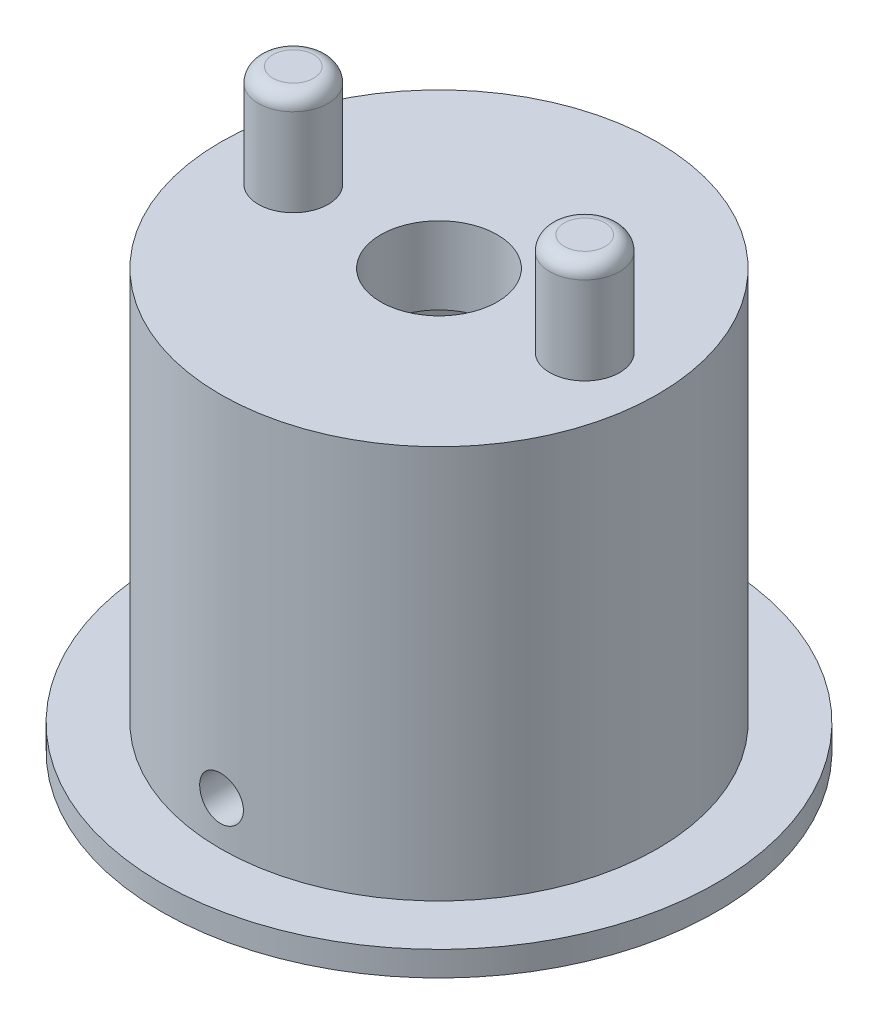
ISO-10303-21;
HEADER;
FILE_DESCRIPTION(('STEP AP214'),'2;1');
FILE_NAME('part.step','',(''),(''),'','','');
FILE_SCHEMA(('AUTOMOTIVE_DESIGN { 1 0 10303 214 1 1 1 1 }'));
ENDSEC;
DATA;
#1=APPLICATION_CONTEXT('core data for automotive mechanical design processes');
#2=APPLICATION_PROTOCOL_DEFINITION('international standard','automotive_design',2000,#1);
#3=PRODUCT_CONTEXT('',#1,'mechanical');
#4=PRODUCT('Part','Part','',(#3));
#5=PRODUCT_RELATED_PRODUCT_CATEGORY('part','',(#4));
#6=PRODUCT_DEFINITION_FORMATION('','',#4);
#7=PRODUCT_DEFINITION_CONTEXT('part definition',#1,'design');
#8=PRODUCT_DEFINITION('design','',#6,#7);
#9=PRODUCT_DEFINITION_SHAPE('','',#8);
#10=(LENGTH_UNIT() NAMED_UNIT(*) SI_UNIT(.MILLI.,.METRE.));
#11=(NAMED_UNIT(*) PLANE_ANGLE_UNIT() SI_UNIT($,.RADIAN.));
#12=(NAMED_UNIT(*) SI_UNIT($,.STERADIAN.) SOLID_ANGLE_UNIT());
#13=UNCERTAINTY_MEASURE_WITH_UNIT(LENGTH_MEASURE(1.E-05),#10,'distance_accuracy_value','');
#14=(GEOMETRIC_REPRESENTATION_CONTEXT(3) GLOBAL_UNCERTAINTY_ASSIGNED_CONTEXT((#13)) GLOBAL_UNIT_ASSIGNED_CONTEXT((#10,
#11,#12)) REPRESENTATION_CONTEXT('',''));
#15=CARTESIAN_POINT('',(0.,0.,0.));
#16=DIRECTION('',(0.,0.,1.));
#17=DIRECTION('',(1.,0.,0.));
#18=AXIS2_PLACEMENT_3D('',#15,#16,#17);
#19=CARTESIAN_POINT('',(0.,27.,0.));
#20=DIRECTION('',(0.,-1.,0.));
#21=DIRECTION('',(0.,0.,-1.));
#22=AXIS2_PLACEMENT_3D('',#19,#20,#21);
#23=CYLINDRICAL_SURFACE('',#22,15.);
#24=CARTESIAN_POINT('',(0.,4.5,-15.));
#25=CARTESIAN_POINT('',(-0.0840305306873359,4.49999636114943,-14.9999990328115));
#26=CARTESIAN_POINT('',(-0.16811661775166,4.49291509665534,-14.9992863839431));
#27=CARTESIAN_POINT('',(-0.333957597745256,4.46477344456436,-14.9965120139211));
#28=CARTESIAN_POINT('',(-0.415709818753242,4.44369765596312,-14.9944488065104));
#29=CARTESIAN_POINT('',(-0.574457513180122,4.38818663910325,-14.9892062184461));
#30=CARTESIAN_POINT('',(-0.651455826922364,4.35375947922229,-14.9860275120106));
#31=CARTESIAN_POINT('',(-0.79856424144061,4.27253863810254,-14.9789093609146));
#32=CARTESIAN_POINT('',(-0.868675708168615,4.22574741599979,-14.974970067572));
#33=CARTESIAN_POINT('',(-1.00028932601112,4.12094595350659,-14.9667561651199));
#34=CARTESIAN_POINT('',(-1.06176321725234,4.06290030089695,-14.962480523608));
#35=CARTESIAN_POINT('',(-1.17411378214648,3.93731319860546,-14.9540843535939));
#36=CARTESIAN_POINT('',(-1.22498996562398,3.86977130993642,-14.9499638322738));
#37=CARTESIAN_POINT('',(-1.31480095566542,3.72693220247457,-14.9423338732918));
#38=CARTESIAN_POINT('',(-1.35371019818232,3.65161883385771,-14.9388257506636));
#39=CARTESIAN_POINT('',(-1.41831957711414,3.49548662114253,-14.9328305631979));
#40=CARTESIAN_POINT('',(-1.44402003988694,3.41466791312408,-14.9303434731333));
#41=CARTESIAN_POINT('',(-1.48139856240284,3.25010729870099,-14.9266812610947));
#42=CARTESIAN_POINT('',(-1.49312347950569,3.16637613472169,-14.9255017559714));
#43=CARTESIAN_POINT('',(-1.50236292770304,2.99812670490633,-14.9245746459079));
#44=CARTESIAN_POINT('',(-1.4998778323062,2.91360845981691,-14.9248270033312));
#45=CARTESIAN_POINT('',(-1.48080642037902,2.74650703546002,-14.926731103484));
#46=CARTESIAN_POINT('',(-1.46427126618683,2.66391795100696,-14.9283777688598));
#47=CARTESIAN_POINT('',(-1.41764871622588,2.50269305519836,-14.9328770143113));
#48=CARTESIAN_POINT('',(-1.38756113738362,2.42405729726246,-14.9357296106774));
#49=CARTESIAN_POINT('',(-1.31463134082226,2.27280961905167,-14.9423251417811));
#50=CARTESIAN_POINT('',(-1.27176642407997,2.20020871576603,-14.9460696586224));
#51=CARTESIAN_POINT('',(-1.17451504102984,2.06321217763218,-14.9540257759932));
#52=CARTESIAN_POINT('',(-1.12012823750476,1.99881678302736,-14.9582373901918));
#53=CARTESIAN_POINT('',(-1.0010911686181,1.87976190901646,-14.9666757796948));
#54=CARTESIAN_POINT('',(-0.936396718277045,1.82514659717879,-14.970902539995));
#55=CARTESIAN_POINT('',(-0.798734222605669,1.72754455063442,-14.9788774361778));
#56=CARTESIAN_POINT('',(-0.725766167999401,1.68455782896529,-14.9826255715238));
#57=CARTESIAN_POINT('',(-0.573597158538547,1.61143496953462,-14.9892221350064));
#58=CARTESIAN_POINT('',(-0.494395119584855,1.58130107277291,-14.9920704062215));
#59=CARTESIAN_POINT('',(-0.332020825994898,1.53477162493237,-14.9965447116211));
#60=CARTESIAN_POINT('',(-0.248848690164901,1.51837566301407,-14.9981707823559));
#61=CARTESIAN_POINT('',(-0.081277648637856,1.49984353839785,-15.0000127750247));
#62=CARTESIAN_POINT('',(0.00311445315823741,1.49764642762125,-15.000234724016));
#63=CARTESIAN_POINT('',(0.171065689973549,1.50741429457315,-14.999259626352));
#64=CARTESIAN_POINT('',(0.254624836230705,1.51937908097292,-14.998062598867));
#65=CARTESIAN_POINT('',(0.418362310252012,1.55708054313237,-14.9943879230879));
#66=CARTESIAN_POINT('',(0.498547273458028,1.58278868171702,-14.9919129287706));
#67=CARTESIAN_POINT('',(0.653466482075672,1.64721776105591,-14.9859599829091));
#68=CARTESIAN_POINT('',(0.728200605235676,1.6859389935591,-14.9824820088788));
#69=CARTESIAN_POINT('',(0.870372270258214,1.77544625799587,-14.9748971299563));
#70=CARTESIAN_POINT('',(0.937784489623376,1.82627233338873,-14.9707881540516));
#71=CARTESIAN_POINT('',(1.06314243496782,1.93848910161139,-14.9624089930428));
#72=CARTESIAN_POINT('',(1.12108792327377,1.99988005960548,-14.9581388038946));
#73=CARTESIAN_POINT('',(1.22607916483072,2.1317498619885,-14.9499003621113));
#74=CARTESIAN_POINT('',(1.27308491801931,2.20226063481393,-14.9459332520846));
#75=CARTESIAN_POINT('',(1.35458738811574,2.35021104022003,-14.9387674869133));
#76=CARTESIAN_POINT('',(1.38908427608082,2.4276505780326,-14.9355688212606));
#77=CARTESIAN_POINT('',(1.44452281302671,2.58712310919869,-14.9303092145107));
#78=CARTESIAN_POINT('',(1.46548826221779,2.66914776013668,-14.9282462767468));
#79=CARTESIAN_POINT('',(1.49334601069419,2.83557479694116,-14.9254854792431));
#80=CARTESIAN_POINT('',(1.50023871359928,2.91997711454351,-14.9247875803528));
#81=CARTESIAN_POINT('',(1.49974970770688,3.08836603253506,-14.9248366966134));
#82=CARTESIAN_POINT('',(1.49243083438967,3.17235282432422,-14.9255773513051));
#83=CARTESIAN_POINT('',(1.46385817944548,3.33789737575243,-14.9284065583432));
#84=CARTESIAN_POINT('',(1.44260438214324,3.41945513265897,-14.9304951122058));
#85=CARTESIAN_POINT('',(1.38678252944625,3.57782602357179,-14.9357830239478));
#86=CARTESIAN_POINT('',(1.35221631651137,3.65463981244459,-14.9389822281054));
#87=CARTESIAN_POINT('',(1.27075733236657,3.80138533750656,-14.9461312775904));
#88=CARTESIAN_POINT('',(1.22386463018312,3.87131711223095,-14.9500811187143));
#89=CARTESIAN_POINT('',(1.118847834428,4.00263551170791,-14.9583073081455));
#90=CARTESIAN_POINT('',(1.0606769233354,4.06398461455063,-14.9625849709013));
#91=CARTESIAN_POINT('',(0.934847548837664,4.17607834904949,-14.9709728209317));
#92=CARTESIAN_POINT('',(0.867186816162385,4.22682043703576,-14.9750829678446));
#93=CARTESIAN_POINT('',(0.724112151241934,4.31636018078193,-14.9826834310374));
#94=CARTESIAN_POINT('',(0.648679124020145,4.35512743641778,-14.9861721604022));
#95=CARTESIAN_POINT('',(0.492387418650826,4.4193936342358,-14.9921194387484));
#96=CARTESIAN_POINT('',(0.411534974738414,4.44490753643032,-14.9945791486448));
#97=CARTESIAN_POINT('',(0.275187392108557,4.4755809256272,-14.997573206606));
#98=CARTESIAN_POINT('',(0.220563829266763,4.48472556644904,-14.9984790103775));
#99=CARTESIAN_POINT('',(0.110634871225969,4.49693628909265,-14.9996927242618));
#100=CARTESIAN_POINT('',(0.0553294788398368,4.5000023959828,-15.0000006368404));
#101=CARTESIAN_POINT('',(0.,4.5,-15.));
#102=B_SPLINE_CURVE_WITH_KNOTS('',3,(#24,#25,#26,#27,#28,#29,#30,#31,#32,#33,#34,#35,#36,#37,
#38,#39,#40,#41,#42,#43,#44,#45,#46,#47,#48,#49,#50,#51,#52,#53,#54,#55,#56,#57,#58,#59,#60,#61,
#62,#63,#64,#65,#66,#67,#68,#69,#70,#71,#72,#73,#74,#75,#76,#77,#78,#79,#80,#81,#82,#83,#84,#85,
#86,#87,#88,#89,#90,#91,#92,#93,#94,#95,#96,#97,#98,#99,#100,#101),.UNSPECIFIED.,.T.,.F.,(4,2,2,
2,2,2,2,2,2,2,2,2,2,2,2,2,2,2,2,2,2,2,2,2,2,2,2,2,2,2,2,2,2,2,2,2,2,2,4),(0.,0.251889549402711,
0.50405676425323,0.756071828598304,1.00803680637417,1.26080785293442,1.51359058831059,
1.76690963208333,2.02022241663756,2.27268348067795,2.52513790883665,2.77667696161666,
3.0282194124245,3.28021142059342,3.53221080496688,3.7853210129431,4.03843150469658,
4.29158611040372,4.54473314513159,4.79679282911636,5.04884910778715,5.30038402941457,
5.551924590742,5.80430911123048,6.05669996715345,6.30999965412898,6.56329587713061,
6.81614535889505,7.06898758859378,7.32071443940935,7.57244157339059,7.824133880442,
8.0758247780844,8.3285837614148,8.58140328955437,8.83485946539364,9.08802892192943,
9.25388500848523,9.41974041103541),.UNSPECIFIED.);
#103=CARTESIAN_POINT('',(0.,4.5,-15.));
#104=VERTEX_POINT('',#103);
#105=EDGE_CURVE('E231',#104,#104,#102,.T.);
#106=ORIENTED_EDGE('',*,*,#105,.T.);
#107=EDGE_LOOP('',(#106));
#108=FACE_BOUND('',#107,.T.);
#109=CARTESIAN_POINT('',(1.5,3.,14.9248115565993));
#110=CARTESIAN_POINT('',(1.49999636009027,2.9159706537396,14.9248125419535));
#111=CARTESIAN_POINT('',(1.49291528847371,2.83188574738224,14.9255288549133));
#112=CARTESIAN_POINT('',(1.46477447214534,2.6660472205597,14.9283163133718));
#113=CARTESIAN_POINT('',(1.44369932232965,2.58429627294377,14.9303889519183));
#114=CARTESIAN_POINT('',(1.38819017410339,2.42555127117314,14.9356519957108));
#115=CARTESIAN_POINT('',(1.35376427444085,2.34855436591284,14.9388417232018));
#116=CARTESIAN_POINT('',(1.27254640108665,2.20144831156238,14.9459787085773));
#117=CARTESIAN_POINT('',(1.22575688343889,2.13133779827443,14.9499258159649));
#118=CARTESIAN_POINT('',(1.12095714299806,1.99972310451375,14.9581489006485));
#119=CARTESIAN_POINT('',(1.06291112716239,1.93824748574433,14.962425900079));
#120=CARTESIAN_POINT('',(0.937322572979346,1.82589358649465,14.9708175785358));
#121=CARTESIAN_POINT('',(0.869779600359852,1.77501579089054,14.9749322501282));
#122=CARTESIAN_POINT('',(0.726939542476481,1.68520311448927,14.9825457473341));
#123=CARTESIAN_POINT('',(0.651626493794353,1.64629350180951,14.9860432634197));
#124=CARTESIAN_POINT('',(0.495494976431265,1.58168335027698,14.9920172531366));
#125=CARTESIAN_POINT('',(0.414676642002328,1.5559824894458,14.994493751656));
#126=CARTESIAN_POINT('',(0.250117174114424,1.51860313597013,14.9981394985654));
#127=CARTESIAN_POINT('',(0.166386790547372,1.50687775087508,14.9993131176423));
#128=CARTESIAN_POINT('',(-0.00186111103341474,1.49763709629943,15.0002357339804));
#129=CARTESIAN_POINT('',(-0.0863786085816919,1.50012145838059,14.9999847681791));
#130=CARTESIAN_POINT('',(-0.25348326609684,1.51919170897524,14.9980900696678));
#131=CARTESIAN_POINT('',(-0.336076244902468,1.53572717334584,14.9964513172757));
#132=CARTESIAN_POINT('',(-0.497308769256799,1.58235169341993,14.991970938974));
#133=CARTESIAN_POINT('',(-0.575948263436593,1.61244092518136,14.9891292974393));
#134=CARTESIAN_POINT('',(-0.727200472019379,1.68537414488166,14.9825540622587));
#135=CARTESIAN_POINT('',(-0.799802356472475,1.72824044629524,14.9788189104864));
#136=CARTESIAN_POINT('',(-0.936800269761291,1.82549478500456,14.9708757677911));
#137=CARTESIAN_POINT('',(-1.00119605784124,1.87988316021778,14.9666677630022));
#138=CARTESIAN_POINT('',(-1.12024915773403,1.99892134427047,14.9582294020178));
#139=CARTESIAN_POINT('',(-1.17486261928552,2.06361501711237,14.9539990285954));
#140=CARTESIAN_POINT('',(-1.27246130303688,2.20127529781617,14.9460110989233));
#141=CARTESIAN_POINT('',(-1.31544650836933,2.27424191767822,14.9422535433595));
#142=CARTESIAN_POINT('',(-1.38856827685985,2.42641053779969,14.9356363427122));
#143=CARTESIAN_POINT('',(-1.41870213085944,2.50561384863433,14.9327768869883));
#144=CARTESIAN_POINT('',(-1.46523110345638,2.66799090692203,14.9282835280641));
#145=CARTESIAN_POINT('',(-1.48162664061455,2.75116453333117,14.9266495875265));
#146=CARTESIAN_POINT('',(-1.50015716308794,2.91873626929426,14.9247987079113));
#147=CARTESIAN_POINT('',(-1.50235349497082,3.00312753039725,14.924575673214));
#148=CARTESIAN_POINT('',(-1.49258437030704,3.1710768987343,14.9255557703216));
#149=CARTESIAN_POINT('',(-1.48061910511463,3.25463501721055,14.9267588828559));
#150=CARTESIAN_POINT('',(-1.44291776176128,3.41836737341751,14.930450166336));
#151=CARTESIAN_POINT('',(-1.41721069078336,3.49854835664199,14.9329356300202));
#152=CARTESIAN_POINT('',(-1.35278507951391,3.65346007759546,14.9389093655819));
#153=CARTESIAN_POINT('',(-1.31406624117538,3.72819069043078,14.94239766043));
#154=CARTESIAN_POINT('',(-1.22456250213483,3.87035996104317,14.9499987653357));
#155=CARTESIAN_POINT('',(-1.17373694976104,3.93777291294938,14.9541136622201));
#156=CARTESIAN_POINT('',(-1.06152080017676,4.0631325799111,14.9624974893778));
#157=CARTESIAN_POINT('',(-1.0001299413722,4.12107906051012,14.966766423463));
#158=CARTESIAN_POINT('',(-0.868259706339711,4.22607245009714,14.9749957177395));
#159=CARTESIAN_POINT('',(-0.797748383954178,4.27307933937933,14.9789549108321));
#160=CARTESIAN_POINT('',(-0.649796576125697,4.35458380275962,14.9861016315995));
#161=CARTESIAN_POINT('',(-0.572356185644439,4.38908154826066,14.9892891698474));
#162=CARTESIAN_POINT('',(-0.412884189649224,4.44452065148301,14.9945281562101));
#163=CARTESIAN_POINT('',(-0.33086105647494,4.46548618098782,14.9965816290847));
#164=CARTESIAN_POINT('',(-0.16443722097552,4.49334460436977,14.9993294192047));
#165=CARTESIAN_POINT('',(-0.0800365855383273,4.50023789375106,15.0000237746484));
#166=CARTESIAN_POINT('',(0.0883533361136191,4.49975060034009,14.999975074699));
#167=CARTESIAN_POINT('',(0.172342810836791,4.49243214474502,14.99923827565));
#168=CARTESIAN_POINT('',(0.337892832534543,4.46385938151454,14.9964224036639));
#169=CARTESIAN_POINT('',(0.419453377602548,4.44260506294055,14.9943433296731));
#170=CARTESIAN_POINT('',(0.577829863151615,4.3867811139106,14.9890758572094));
#171=CARTESIAN_POINT('',(0.654646449116292,4.35221329959877,14.9858876100487));
#172=CARTESIAN_POINT('',(0.801396900232193,4.27075024662453,14.9787571862444));
#173=CARTESIAN_POINT('',(0.871330805652838,4.22385508009333,14.9748150140123));
#174=CARTESIAN_POINT('',(1.00264908664041,4.11883557146438,14.9665977700358));
#175=CARTESIAN_POINT('',(1.06399638932901,4.0606649756328,14.9623213719105));
#176=CARTESIAN_POINT('',(1.17608663908971,3.93483697268183,14.9539288615449));
#177=CARTESIAN_POINT('',(1.22682703777177,3.86717729224639,14.9498127880167));
#178=CARTESIAN_POINT('',(1.31636496063608,3.72410348712014,14.942195751159));
#179=CARTESIAN_POINT('',(1.35513178199225,3.64867007801392,14.9386963788796));
#180=CARTESIAN_POINT('',(1.41939706214815,3.49237756313065,14.9327279214369));
#181=CARTESIAN_POINT('',(1.44491048683479,3.41152469411143,14.9302576748004));
#182=CARTESIAN_POINT('',(1.47558253250029,3.27517838865133,14.9272501130722));
#183=CARTESIAN_POINT('',(1.48472656859734,3.22055662304036,14.9263399790354));
#184=CARTESIAN_POINT('',(1.49693648790767,3.11063126543617,14.9251203776649));
#185=CARTESIAN_POINT('',(1.5000023966359,3.05532767630611,14.9248109078098));
#186=CARTESIAN_POINT('',(1.5,3.,14.9248115565993));
#187=B_SPLINE_CURVE_WITH_KNOTS('',3,(#109,#110,#111,#112,#113,#114,#115,#116,#117,#118,#119,
#120,#121,#122,#123,#124,#125,#126,#127,#128,#129,#130,#131,#132,#133,#134,#135,#136,#137,#138,
#139,#140,#141,#142,#143,#144,#145,#146,#147,#148,#149,#150,#151,#152,#153,#154,#155,#156,#157,
#158,#159,#160,#161,#162,#163,#164,#165,#166,#167,#168,#169,#170,#171,#172,#173,#174,#175,#176,
#177,#178,#179,#180,#181,#182,#183,#184,#185,#186),.UNSPECIFIED.,.T.,.F.,(4,2,2,2,2,2,2,2,2,2,2,
2,2,2,2,2,2,2,2,2,2,2,2,2,2,2,2,2,2,2,2,2,2,2,2,2,2,2,4),(0.,0.251885991654692,
0.504049727732655,0.756060736496211,1.00802172063197,1.26079742294888,1.51358468782879,
1.76690204956938,2.02021323611692,2.27267206347674,2.52512434497348,2.77667447727992,
3.02822787721461,3.2802231819962,3.53222587827793,3.78533137627502,4.03843724141344,
4.291596436769,4.54474791892549,4.79680494461648,5.04885856450305,5.30038222056791,
5.55191163841571,5.80429784717577,6.05669030584804,6.30999205227177,6.56329032777007,
6.81613489041542,7.06897234669724,7.32070700202724,7.57244185494987,7.82414237992869,
8.07584143216198,8.32859572556982,8.58141067551787,8.83486861605715,9.08803972341001,
9.2538904140907,9.41974040855723),.UNSPECIFIED.);
#188=CARTESIAN_POINT('',(1.5,3.,14.9248115565993));
#189=VERTEX_POINT('',#188);
#190=EDGE_CURVE('E225',#189,#189,#187,.T.);
#191=ORIENTED_EDGE('',*,*,#190,.T.);
#192=EDGE_LOOP('',(#191));
#193=FACE_BOUND('',#192,.T.);
#194=CARTESIAN_POINT('',(0.,27.,0.));
#195=DIRECTION('',(0.,1.,0.));
#196=DIRECTION('',(0.,0.,1.));
#197=AXIS2_PLACEMENT_3D('',#194,#195,#196);
#198=CIRCLE('',#197,15.);
#199=CARTESIAN_POINT('',(0.,27.,15.));
#200=VERTEX_POINT('',#199);
#201=EDGE_CURVE('E174',#200,#200,#198,.T.);
#202=ORIENTED_EDGE('',*,*,#201,.F.);
#203=EDGE_LOOP('',(#202));
#204=FACE_BOUND('',#203,.T.);
#205=CARTESIAN_POINT('',(0.,0.,0.));
#206=DIRECTION('',(0.,1.,0.));
#207=DIRECTION('',(0.,0.,1.));
#208=AXIS2_PLACEMENT_3D('',#205,#206,#207);
#209=CIRCLE('',#208,15.);
#210=CARTESIAN_POINT('',(0.,0.,15.));
#211=VERTEX_POINT('',#210);
#212=EDGE_CURVE('E170',#211,#211,#209,.T.);
#213=ORIENTED_EDGE('',*,*,#212,.T.);
#214=EDGE_LOOP('',(#213));
#215=FACE_BOUND('',#214,.T.);
#216=ADVANCED_FACE('F39',(#108,#193,#204,#215),#23,.T.);
#217=CARTESIAN_POINT('',(0.,27.,0.));
#218=DIRECTION('',(0.,1.,0.));
#219=DIRECTION('',(0.,0.,1.));
#220=AXIS2_PLACEMENT_3D('',#217,#218,#219);
#221=PLANE('',#220);
#222=CARTESIAN_POINT('',(10.,27.,0.));
#223=DIRECTION('',(0.,1.,0.));
#224=DIRECTION('',(0.,0.,1.));
#225=AXIS2_PLACEMENT_3D('',#222,#223,#224);
#226=CIRCLE('',#225,2.4);
#227=CARTESIAN_POINT('',(10.,27.,2.4));
#228=VERTEX_POINT('',#227);
#229=EDGE_CURVE('E237',#228,#228,#226,.T.);
#230=ORIENTED_EDGE('',*,*,#229,.F.);
#231=EDGE_LOOP('',(#230));
#232=FACE_BOUND('',#231,.T.);
#233=CARTESIAN_POINT('',(-10.,27.,0.));
#234=DIRECTION('',(0.,1.,0.));
#235=DIRECTION('',(0.,0.,1.));
#236=AXIS2_PLACEMENT_3D('',#233,#234,#235);
#237=CIRCLE('',#236,2.4);
#238=CARTESIAN_POINT('',(-10.,27.,2.4));
#239=VERTEX_POINT('',#238);
#240=EDGE_CURVE('E436',#239,#239,#237,.T.);
#241=ORIENTED_EDGE('',*,*,#240,.F.);
#242=EDGE_LOOP('',(#241));
#243=FACE_BOUND('',#242,.T.);
#244=CARTESIAN_POINT('',(0.,27.,0.));
#245=DIRECTION('',(0.,1.,0.));
#246=DIRECTION('',(0.,0.,1.));
#247=AXIS2_PLACEMENT_3D('',#244,#245,#246);
#248=CIRCLE('',#247,4.);
#249=CARTESIAN_POINT('',(0.,27.,4.));
#250=VERTEX_POINT('',#249);
#251=EDGE_CURVE('E137',#250,#250,#248,.F.);
#252=ORIENTED_EDGE('',*,*,#251,.T.);
#253=EDGE_LOOP('',(#252));
#254=FACE_BOUND('',#253,.T.);
#255=ORIENTED_EDGE('',*,*,#201,.T.);
#256=EDGE_LOOP('',(#255));
#257=FACE_BOUND('',#256,.T.);
#258=ADVANCED_FACE('F210',(#232,#243,#254,#257),#221,.T.);
#259=CARTESIAN_POINT('',(0.,-1.7,0.));
#260=DIRECTION('',(0.,1.,0.));
#261=DIRECTION('',(0.,0.,1.));
#262=AXIS2_PLACEMENT_3D('',#259,#260,#261);
#263=CYLINDRICAL_SURFACE('',#262,19.07);
#264=CARTESIAN_POINT('',(0.,-1.7,0.));
#265=DIRECTION('',(0.,-1.,0.));
#266=DIRECTION('',(0.,0.,-1.));
#267=AXIS2_PLACEMENT_3D('',#264,#265,#266);
#268=CIRCLE('',#267,19.07);
#269=CARTESIAN_POINT('',(0.,-1.7,-19.07));
#270=VERTEX_POINT('',#269);
#271=EDGE_CURVE('E166',#270,#270,#268,.T.);
#272=ORIENTED_EDGE('',*,*,#271,.F.);
#273=EDGE_LOOP('',(#272));
#274=FACE_BOUND('',#273,.T.);
#275=CARTESIAN_POINT('',(0.,0.,0.));
#276=DIRECTION('',(0.,-1.,0.));
#277=DIRECTION('',(0.,0.,-1.));
#278=AXIS2_PLACEMENT_3D('',#275,#276,#277);
#279=CIRCLE('',#278,19.07);
#280=CARTESIAN_POINT('',(0.,0.,-19.07));
#281=VERTEX_POINT('',#280);
#282=EDGE_CURVE('E156',#281,#281,#279,.T.);
#283=ORIENTED_EDGE('',*,*,#282,.T.);
#284=EDGE_LOOP('',(#283));
#285=FACE_BOUND('',#284,.T.);
#286=ADVANCED_FACE('F216',(#274,#285),#263,.T.);
#287=CARTESIAN_POINT('',(0.,-1.7,0.));
#288=DIRECTION('',(0.,-1.,0.));
#289=DIRECTION('',(0.,0.,-1.));
#290=AXIS2_PLACEMENT_3D('',#287,#288,#289);
#291=PLANE('',#290);
#292=DIRECTION('',(-1.,0.,0.));
#293=VECTOR('',#292,1.);
#294=CARTESIAN_POINT('',(2.80014880556968,-1.7,4.85));
#295=LINE('',#294,#293);
#296=CARTESIAN_POINT('',(2.80014880556968,-1.7,4.85));
#297=VERTEX_POINT('',#296);
#298=CARTESIAN_POINT('',(-2.80014880556969,-1.7,4.85));
#299=VERTEX_POINT('',#298);
#300=EDGE_CURVE('E56',#297,#299,#295,.T.);
#301=ORIENTED_EDGE('',*,*,#300,.F.);
#302=DIRECTION('',(-0.500000000000001,0.,0.866025403784438));
#303=VECTOR('',#302,1.);
#304=CARTESIAN_POINT('',(5.60029761113937,-1.7,0.));
#305=LINE('',#304,#303);
#306=CARTESIAN_POINT('',(5.60029761113937,-1.7,0.));
#307=VERTEX_POINT('',#306);
#308=EDGE_CURVE('E150',#307,#297,#305,.T.);
#309=ORIENTED_EDGE('',*,*,#308,.F.);
#310=DIRECTION('',(0.5,0.,0.866025403784439));
#311=VECTOR('',#310,1.);
#312=CARTESIAN_POINT('',(2.80014880556968,-1.7,-4.85));
#313=LINE('',#312,#311);
#314=CARTESIAN_POINT('',(2.80014880556968,-1.7,-4.85));
#315=VERTEX_POINT('',#314);
#316=EDGE_CURVE('E147',#315,#307,#313,.T.);
#317=ORIENTED_EDGE('',*,*,#316,.F.);
#318=DIRECTION('',(1.,0.,0.));
#319=VECTOR('',#318,1.);
#320=CARTESIAN_POINT('',(-2.80014880556968,-1.7,-4.85));
#321=LINE('',#320,#319);
#322=CARTESIAN_POINT('',(-2.80014880556968,-1.7,-4.85));
#323=VERTEX_POINT('',#322);
#324=EDGE_CURVE('E104',#323,#315,#321,.T.);
#325=ORIENTED_EDGE('',*,*,#324,.F.);
#326=DIRECTION('',(0.500000000000001,0.,-0.866025403784438));
#327=VECTOR('',#326,1.);
#328=CARTESIAN_POINT('',(-5.60029761113937,-1.7,0.));
#329=LINE('',#328,#327);
#330=CARTESIAN_POINT('',(-5.60029761113937,-1.7,0.));
#331=VERTEX_POINT('',#330);
#332=EDGE_CURVE('E141',#331,#323,#329,.T.);
#333=ORIENTED_EDGE('',*,*,#332,.F.);
#334=DIRECTION('',(-0.5,0.,-0.866025403784439));
#335=VECTOR('',#334,1.);
#336=CARTESIAN_POINT('',(-2.80014880556969,-1.7,4.85));
#337=LINE('',#336,#335);
#338=EDGE_CURVE('E136',#299,#331,#337,.T.);
#339=ORIENTED_EDGE('',*,*,#338,.F.);
#340=EDGE_LOOP('',(#301,#309,#317,#325,#333,#339));
#341=FACE_BOUND('',#340,.T.);
#342=ORIENTED_EDGE('',*,*,#271,.T.);
#343=EDGE_LOOP('',(#342));
#344=FACE_BOUND('',#343,.T.);
#345=ADVANCED_FACE('F283',(#341,#344),#291,.T.);
#346=CARTESIAN_POINT('',(0.,0.,0.));
#347=DIRECTION('',(0.,-1.,0.));
#348=DIRECTION('',(0.,0.,-1.));
#349=AXIS2_PLACEMENT_3D('',#346,#347,#348);
#350=PLANE('',#349);
#351=ORIENTED_EDGE('',*,*,#212,.F.);
#352=EDGE_LOOP('',(#351));
#353=FACE_BOUND('',#352,.T.);
#354=ORIENTED_EDGE('',*,*,#282,.F.);
#355=EDGE_LOOP('',(#354));
#356=FACE_BOUND('',#355,.T.);
#357=ADVANCED_FACE('F281',(#353,#356),#350,.F.);
#358=CARTESIAN_POINT('',(2.80014880556968,21.7,4.85));
#359=DIRECTION('',(0.,0.,1.));
#360=DIRECTION('',(1.,0.,0.));
#361=AXIS2_PLACEMENT_3D('',#358,#359,#360);
#362=PLANE('',#361);
#363=CARTESIAN_POINT('',(0.,3.,4.85));
#364=DIRECTION('',(0.,0.,1.));
#365=DIRECTION('',(1.,0.,0.));
#366=AXIS2_PLACEMENT_3D('',#363,#364,#365);
#367=CIRCLE('',#366,1.5);
#368=CARTESIAN_POINT('',(1.5,3.,4.85));
#369=VERTEX_POINT('',#368);
#370=EDGE_CURVE('E423',#369,#369,#367,.T.);
#371=ORIENTED_EDGE('',*,*,#370,.T.);
#372=EDGE_LOOP('',(#371));
#373=FACE_BOUND('',#372,.T.);
#374=ORIENTED_EDGE('',*,*,#300,.T.);
#375=DIRECTION('',(0.,-1.,0.));
#376=VECTOR('',#375,1.);
#377=CARTESIAN_POINT('',(-2.80014880556969,21.7,4.85));
#378=LINE('',#377,#376);
#379=CARTESIAN_POINT('',(-2.80014880556969,21.7,4.85));
#380=VERTEX_POINT('',#379);
#381=EDGE_CURVE('E86',#380,#299,#378,.T.);
#382=ORIENTED_EDGE('',*,*,#381,.F.);
#383=DIRECTION('',(-1.,0.,0.));
#384=VECTOR('',#383,1.);
#385=CARTESIAN_POINT('',(2.80014880556968,21.7,4.85));
#386=LINE('',#385,#384);
#387=CARTESIAN_POINT('',(2.80014880556968,21.7,4.85));
#388=VERTEX_POINT('',#387);
#389=EDGE_CURVE('E153',#388,#380,#386,.T.);
#390=ORIENTED_EDGE('',*,*,#389,.F.);
#391=DIRECTION('',(0.,-1.,0.));
#392=VECTOR('',#391,1.);
#393=CARTESIAN_POINT('',(2.80014880556968,21.7,4.85));
#394=LINE('',#393,#392);
#395=EDGE_CURVE('E64',#388,#297,#394,.T.);
#396=ORIENTED_EDGE('',*,*,#395,.T.);
#397=EDGE_LOOP('',(#374,#382,#390,#396));
#398=FACE_BOUND('',#397,.T.);
#399=ADVANCED_FACE('F266',(#373,#398),#362,.F.);
#400=CARTESIAN_POINT('',(5.60029761113937,21.7,0.));
#401=DIRECTION('',(0.866025403784438,0.,0.500000000000001));
#402=DIRECTION('',(0.500000000000001,0.,-0.866025403784438));
#403=AXIS2_PLACEMENT_3D('',#400,#401,#402);
#404=PLANE('',#403);
#405=ORIENTED_EDGE('',*,*,#308,.T.);
#406=ORIENTED_EDGE('',*,*,#395,.F.);
#407=DIRECTION('',(-0.500000000000001,0.,0.866025403784438));
#408=VECTOR('',#407,1.);
#409=CARTESIAN_POINT('',(5.60029761113937,21.7,0.));
#410=LINE('',#409,#408);
#411=CARTESIAN_POINT('',(5.60029761113937,21.7,0.));
#412=VERTEX_POINT('',#411);
#413=EDGE_CURVE('E118',#412,#388,#410,.T.);
#414=ORIENTED_EDGE('',*,*,#413,.F.);
#415=DIRECTION('',(0.,-1.,0.));
#416=VECTOR('',#415,1.);
#417=CARTESIAN_POINT('',(5.60029761113937,21.7,0.));
#418=LINE('',#417,#416);
#419=EDGE_CURVE('E109',#412,#307,#418,.T.);
#420=ORIENTED_EDGE('',*,*,#419,.T.);
#421=EDGE_LOOP('',(#405,#406,#414,#420));
#422=FACE_BOUND('',#421,.T.);
#423=ADVANCED_FACE('F263',(#422),#404,.F.);
#424=CARTESIAN_POINT('',(2.80014880556968,21.7,-4.85));
#425=DIRECTION('',(0.866025403784439,0.,-0.5));
#426=DIRECTION('',(-0.5,0.,-0.866025403784439));
#427=AXIS2_PLACEMENT_3D('',#424,#425,#426);
#428=PLANE('',#427);
#429=ORIENTED_EDGE('',*,*,#316,.T.);
#430=ORIENTED_EDGE('',*,*,#419,.F.);
#431=DIRECTION('',(0.5,0.,0.866025403784439));
#432=VECTOR('',#431,1.);
#433=CARTESIAN_POINT('',(2.80014880556968,21.7,-4.85));
#434=LINE('',#433,#432);
#435=CARTESIAN_POINT('',(2.80014880556968,21.7,-4.85));
#436=VERTEX_POINT('',#435);
#437=EDGE_CURVE('E113',#436,#412,#434,.T.);
#438=ORIENTED_EDGE('',*,*,#437,.F.);
#439=DIRECTION('',(0.,-1.,0.));
#440=VECTOR('',#439,1.);
#441=CARTESIAN_POINT('',(2.80014880556968,21.7,-4.85));
#442=LINE('',#441,#440);
#443=EDGE_CURVE('E97',#436,#315,#442,.T.);
#444=ORIENTED_EDGE('',*,*,#443,.T.);
#445=EDGE_LOOP('',(#429,#430,#438,#444));
#446=FACE_BOUND('',#445,.T.);
#447=ADVANCED_FACE('F114',(#446),#428,.F.);
#448=CARTESIAN_POINT('',(-2.80014880556968,21.7,-4.85));
#449=DIRECTION('',(0.,0.,-1.));
#450=DIRECTION('',(-1.,0.,0.));
#451=AXIS2_PLACEMENT_3D('',#448,#449,#450);
#452=PLANE('',#451);
#453=CARTESIAN_POINT('',(0.,3.,-4.85));
#454=DIRECTION('',(0.,0.,-1.));
#455=DIRECTION('',(-1.,0.,0.));
#456=AXIS2_PLACEMENT_3D('',#453,#454,#455);
#457=CIRCLE('',#456,1.5);
#458=CARTESIAN_POINT('',(-1.5,3.,-4.85));
#459=VERTEX_POINT('',#458);
#460=EDGE_CURVE('E43',#459,#459,#457,.T.);
#461=ORIENTED_EDGE('',*,*,#460,.T.);
#462=EDGE_LOOP('',(#461));
#463=FACE_BOUND('',#462,.T.);
#464=ORIENTED_EDGE('',*,*,#324,.T.);
#465=ORIENTED_EDGE('',*,*,#443,.F.);
#466=DIRECTION('',(1.,0.,0.));
#467=VECTOR('',#466,1.);
#468=CARTESIAN_POINT('',(-2.80014880556968,21.7,-4.85));
#469=LINE('',#468,#467);
#470=CARTESIAN_POINT('',(-2.80014880556968,21.7,-4.85));
#471=VERTEX_POINT('',#470);
#472=EDGE_CURVE('E101',#471,#436,#469,.T.);
#473=ORIENTED_EDGE('',*,*,#472,.F.);
#474=DIRECTION('',(0.,-1.,0.));
#475=VECTOR('',#474,1.);
#476=CARTESIAN_POINT('',(-2.80014880556968,21.7,-4.85));
#477=LINE('',#476,#475);
#478=EDGE_CURVE('E110',#471,#323,#477,.T.);
#479=ORIENTED_EDGE('',*,*,#478,.T.);
#480=EDGE_LOOP('',(#464,#465,#473,#479));
#481=FACE_BOUND('',#480,.T.);
#482=ADVANCED_FACE('F99',(#463,#481),#452,.F.);
#483=CARTESIAN_POINT('',(-5.60029761113937,21.7,0.));
#484=DIRECTION('',(-0.866025403784438,0.,-0.500000000000001));
#485=DIRECTION('',(-0.500000000000001,0.,0.866025403784438));
#486=AXIS2_PLACEMENT_3D('',#483,#484,#485);
#487=PLANE('',#486);
#488=ORIENTED_EDGE('',*,*,#332,.T.);
#489=ORIENTED_EDGE('',*,*,#478,.F.);
#490=DIRECTION('',(0.500000000000001,0.,-0.866025403784438));
#491=VECTOR('',#490,1.);
#492=CARTESIAN_POINT('',(-5.60029761113937,21.7,0.));
#493=LINE('',#492,#491);
#494=CARTESIAN_POINT('',(-5.60029761113937,21.7,0.));
#495=VERTEX_POINT('',#494);
#496=EDGE_CURVE('E124',#495,#471,#493,.T.);
#497=ORIENTED_EDGE('',*,*,#496,.F.);
#498=DIRECTION('',(0.,-1.,0.));
#499=VECTOR('',#498,1.);
#500=CARTESIAN_POINT('',(-5.60029761113937,21.7,0.));
#501=LINE('',#500,#499);
#502=EDGE_CURVE('E161',#495,#331,#501,.T.);
#503=ORIENTED_EDGE('',*,*,#502,.T.);
#504=EDGE_LOOP('',(#488,#489,#497,#503));
#505=FACE_BOUND('',#504,.T.);
#506=ADVANCED_FACE('F271',(#505),#487,.F.);
#507=CARTESIAN_POINT('',(-2.80014880556969,21.7,4.85));
#508=DIRECTION('',(-0.866025403784439,0.,0.5));
#509=DIRECTION('',(0.5,0.,0.866025403784439));
#510=AXIS2_PLACEMENT_3D('',#507,#508,#509);
#511=PLANE('',#510);
#512=ORIENTED_EDGE('',*,*,#338,.T.);
#513=ORIENTED_EDGE('',*,*,#502,.F.);
#514=DIRECTION('',(-0.5,0.,-0.866025403784439));
#515=VECTOR('',#514,1.);
#516=CARTESIAN_POINT('',(-2.80014880556969,21.7,4.85));
#517=LINE('',#516,#515);
#518=EDGE_CURVE('E128',#380,#495,#517,.T.);
#519=ORIENTED_EDGE('',*,*,#518,.F.);
#520=ORIENTED_EDGE('',*,*,#381,.T.);
#521=EDGE_LOOP('',(#512,#513,#519,#520));
#522=FACE_BOUND('',#521,.T.);
#523=ADVANCED_FACE('F261',(#522),#511,.F.);
#524=CARTESIAN_POINT('',(0.,21.7,0.));
#525=DIRECTION('',(0.,-1.,0.));
#526=DIRECTION('',(0.,0.,-1.));
#527=AXIS2_PLACEMENT_3D('',#524,#525,#526);
#528=PLANE('',#527);
#529=CARTESIAN_POINT('',(0.,21.7,0.));
#530=DIRECTION('',(0.,-1.,0.));
#531=DIRECTION('',(0.,0.,-1.));
#532=AXIS2_PLACEMENT_3D('',#529,#530,#531);
#533=CIRCLE('',#532,4.);
#534=CARTESIAN_POINT('',(0.,21.7,-4.));
#535=VERTEX_POINT('',#534);
#536=EDGE_CURVE('E439',#535,#535,#533,.T.);
#537=ORIENTED_EDGE('',*,*,#536,.F.);
#538=EDGE_LOOP('',(#537));
#539=FACE_BOUND('',#538,.T.);
#540=ORIENTED_EDGE('',*,*,#389,.T.);
#541=ORIENTED_EDGE('',*,*,#518,.T.);
#542=ORIENTED_EDGE('',*,*,#496,.T.);
#543=ORIENTED_EDGE('',*,*,#472,.T.);
#544=ORIENTED_EDGE('',*,*,#437,.T.);
#545=ORIENTED_EDGE('',*,*,#413,.T.);
#546=EDGE_LOOP('',(#540,#541,#542,#543,#544,#545));
#547=FACE_BOUND('',#546,.T.);
#548=ADVANCED_FACE('F121',(#539,#547),#528,.T.);
#549=CARTESIAN_POINT('',(0.,38.3137084989848,0.));
#550=DIRECTION('',(0.,-1.,0.));
#551=DIRECTION('',(0.,0.,-1.));
#552=AXIS2_PLACEMENT_3D('',#549,#550,#551);
#553=CYLINDRICAL_SURFACE('',#552,4.);
#554=ORIENTED_EDGE('',*,*,#536,.T.);
#555=EDGE_LOOP('',(#554));
#556=FACE_BOUND('',#555,.T.);
#557=ORIENTED_EDGE('',*,*,#251,.F.);
#558=EDGE_LOOP('',(#557));
#559=FACE_BOUND('',#558,.T.);
#560=ADVANCED_FACE('F254',(#556,#559),#553,.F.);
#561=CARTESIAN_POINT('',(-10.,34.,0.));
#562=DIRECTION('',(0.,-1.,0.));
#563=DIRECTION('',(0.,0.,-1.));
#564=AXIS2_PLACEMENT_3D('',#561,#562,#563);
#565=CYLINDRICAL_SURFACE('',#564,2.4);
#566=CARTESIAN_POINT('',(-10.,33.,0.));
#567=DIRECTION('',(0.,1.,0.));
#568=DIRECTION('',(0.,0.,1.));
#569=AXIS2_PLACEMENT_3D('',#566,#567,#568);
#570=CIRCLE('',#569,2.4);
#571=CARTESIAN_POINT('',(-10.,33.,2.4));
#572=VERTEX_POINT('',#571);
#573=EDGE_CURVE('E11',#572,#572,#570,.F.);
#574=ORIENTED_EDGE('',*,*,#573,.T.);
#575=EDGE_LOOP('',(#574));
#576=FACE_BOUND('',#575,.T.);
#577=ORIENTED_EDGE('',*,*,#240,.T.);
#578=EDGE_LOOP('',(#577));
#579=FACE_BOUND('',#578,.T.);
#580=ADVANCED_FACE('F251',(#576,#579),#565,.T.);
#581=CARTESIAN_POINT('',(-10.,34.,0.));
#582=DIRECTION('',(0.,1.,0.));
#583=DIRECTION('',(0.,0.,1.));
#584=AXIS2_PLACEMENT_3D('',#581,#582,#583);
#585=PLANE('',#584);
#586=CARTESIAN_POINT('',(-10.,34.,0.));
#587=DIRECTION('',(0.,1.,0.));
#588=DIRECTION('',(0.,0.,1.));
#589=AXIS2_PLACEMENT_3D('',#586,#587,#588);
#590=CIRCLE('',#589,1.4);
#591=CARTESIAN_POINT('',(-10.,34.,1.4));
#592=VERTEX_POINT('',#591);
#593=EDGE_CURVE('E49',#592,#592,#590,.T.);
#594=ORIENTED_EDGE('',*,*,#593,.T.);
#595=EDGE_LOOP('',(#594));
#596=FACE_BOUND('',#595,.T.);
#597=ADVANCED_FACE('F193',(#596),#585,.T.);
#598=CARTESIAN_POINT('',(10.,34.,0.));
#599=DIRECTION('',(0.,-1.,0.));
#600=DIRECTION('',(0.,0.,-1.));
#601=AXIS2_PLACEMENT_3D('',#598,#599,#600);
#602=CYLINDRICAL_SURFACE('',#601,2.4);
#603=CARTESIAN_POINT('',(10.,33.,0.));
#604=DIRECTION('',(0.,1.,0.));
#605=DIRECTION('',(0.,0.,1.));
#606=AXIS2_PLACEMENT_3D('',#603,#604,#605);
#607=CIRCLE('',#606,2.4);
#608=CARTESIAN_POINT('',(10.,33.,2.4));
#609=VERTEX_POINT('',#608);
#610=EDGE_CURVE('E185',#609,#609,#607,.F.);
#611=ORIENTED_EDGE('',*,*,#610,.T.);
#612=EDGE_LOOP('',(#611));
#613=FACE_BOUND('',#612,.T.);
#614=ORIENTED_EDGE('',*,*,#229,.T.);
#615=EDGE_LOOP('',(#614));
#616=FACE_BOUND('',#615,.T.);
#617=ADVANCED_FACE('F244',(#613,#616),#602,.T.);
#618=CARTESIAN_POINT('',(10.,34.,0.));
#619=DIRECTION('',(0.,1.,0.));
#620=DIRECTION('',(0.,0.,1.));
#621=AXIS2_PLACEMENT_3D('',#618,#619,#620);
#622=PLANE('',#621);
#623=CARTESIAN_POINT('',(10.,34.,0.));
#624=DIRECTION('',(0.,1.,0.));
#625=DIRECTION('',(0.,0.,1.));
#626=AXIS2_PLACEMENT_3D('',#623,#624,#625);
#627=CIRCLE('',#626,1.4);
#628=CARTESIAN_POINT('',(10.,34.,1.4));
#629=VERTEX_POINT('',#628);
#630=EDGE_CURVE('E178',#629,#629,#627,.T.);
#631=ORIENTED_EDGE('',*,*,#630,.T.);
#632=EDGE_LOOP('',(#631));
#633=FACE_BOUND('',#632,.T.);
#634=ADVANCED_FACE('F206',(#633),#622,.T.);
#635=CARTESIAN_POINT('',(10.,33.,0.));
#636=DIRECTION('',(0.,1.,0.));
#637=DIRECTION('',(0.,0.,1.));
#638=AXIS2_PLACEMENT_3D('',#635,#636,#637);
#639=TOROIDAL_SURFACE('',#638,1.4,1.);
#640=ORIENTED_EDGE('',*,*,#610,.F.);
#641=EDGE_LOOP('',(#640));
#642=FACE_BOUND('',#641,.T.);
#643=ORIENTED_EDGE('',*,*,#630,.F.);
#644=EDGE_LOOP('',(#643));
#645=FACE_BOUND('',#644,.T.);
#646=ADVANCED_FACE('F197',(#642,#645),#639,.T.);
#647=CARTESIAN_POINT('',(-10.,33.,0.));
#648=DIRECTION('',(0.,1.,0.));
#649=DIRECTION('',(0.,0.,1.));
#650=AXIS2_PLACEMENT_3D('',#647,#648,#649);
#651=TOROIDAL_SURFACE('',#650,1.4,1.);
#652=ORIENTED_EDGE('',*,*,#573,.F.);
#653=EDGE_LOOP('',(#652));
#654=FACE_BOUND('',#653,.T.);
#655=ORIENTED_EDGE('',*,*,#593,.F.);
#656=EDGE_LOOP('',(#655));
#657=FACE_BOUND('',#656,.T.);
#658=ADVANCED_FACE('F41',(#654,#657),#651,.T.);
#659=CARTESIAN_POINT('',(0.,3.,-19.07));
#660=DIRECTION('',(0.,0.,1.));
#661=DIRECTION('',(1.,0.,0.));
#662=AXIS2_PLACEMENT_3D('',#659,#660,#661);
#663=CYLINDRICAL_SURFACE('',#662,1.5);
#664=ORIENTED_EDGE('',*,*,#460,.F.);
#665=EDGE_LOOP('',(#664));
#666=FACE_BOUND('',#665,.T.);
#667=ORIENTED_EDGE('',*,*,#105,.F.);
#668=EDGE_LOOP('',(#667));
#669=FACE_BOUND('',#668,.T.);
#670=ADVANCED_FACE('F196',(#666,#669),#663,.F.);
#671=ORIENTED_EDGE('',*,*,#370,.F.);
#672=EDGE_LOOP('',(#671));
#673=FACE_BOUND('',#672,.T.);
#674=ORIENTED_EDGE('',*,*,#190,.F.);
#675=EDGE_LOOP('',(#674));
#676=FACE_BOUND('',#675,.T.);
#677=ADVANCED_FACE('F203',(#673,#676),#663,.F.);
#678=CLOSED_SHELL('',(#216,#258,#286,#345,#357,#399,#423,#447,#482,#506,#523,#548,#560,#580,
#597,#617,#634,#646,#658,#670,#677));
#679=MANIFOLD_SOLID_BREP('B2',#678);
#680=ADVANCED_BREP_SHAPE_REPRESENTATION('',(#18,#679),#14);
#681=SHAPE_DEFINITION_REPRESENTATION(#9,#680);
ENDSEC;
END-ISO-10303-21;
